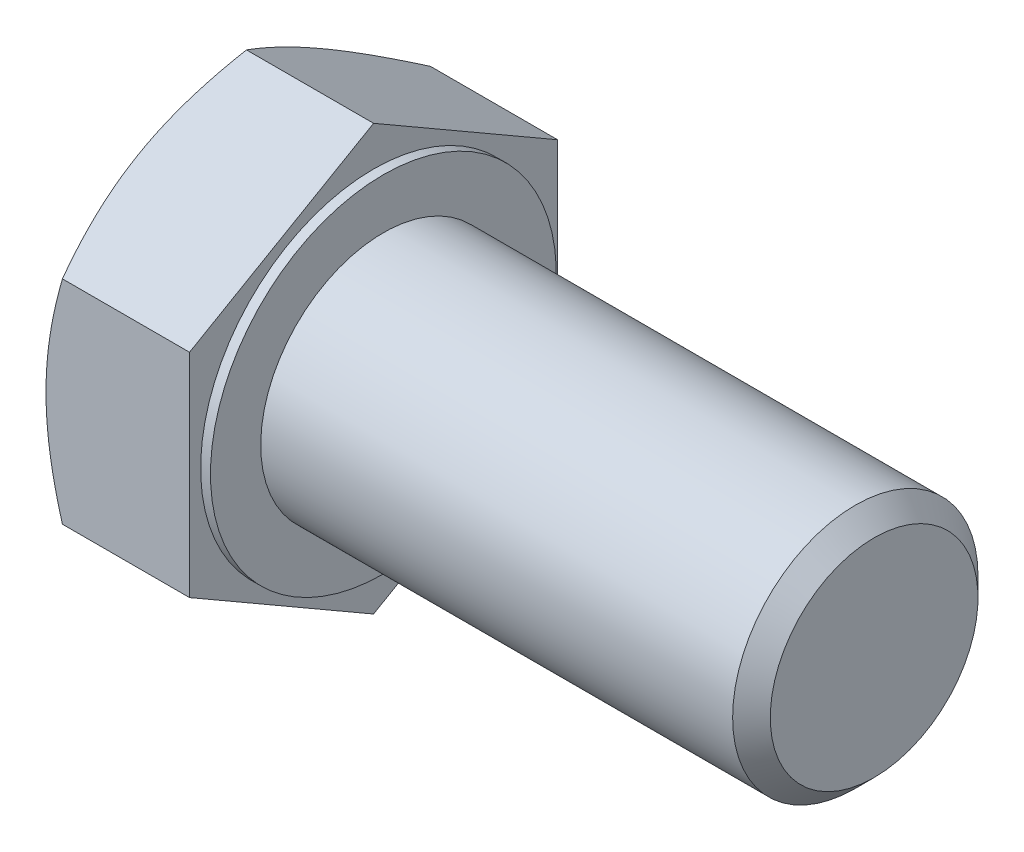
ISO-10303-21;
HEADER;
FILE_DESCRIPTION(('STEP AP214'),'2;1');
FILE_NAME('part.step','',(''),(''),'','','');
FILE_SCHEMA(('AUTOMOTIVE_DESIGN { 1 0 10303 214 1 1 1 1 }'));
ENDSEC;
DATA;
#1=APPLICATION_CONTEXT('core data for automotive mechanical design processes');
#2=APPLICATION_PROTOCOL_DEFINITION('international standard','automotive_design',2000,#1);
#3=PRODUCT_CONTEXT('',#1,'mechanical');
#4=PRODUCT('Part','Part','',(#3));
#5=PRODUCT_RELATED_PRODUCT_CATEGORY('part','',(#4));
#6=PRODUCT_DEFINITION_FORMATION('','',#4);
#7=PRODUCT_DEFINITION_CONTEXT('part definition',#1,'design');
#8=PRODUCT_DEFINITION('design','',#6,#7);
#9=PRODUCT_DEFINITION_SHAPE('','',#8);
#10=(LENGTH_UNIT() NAMED_UNIT(*) SI_UNIT(.MILLI.,.METRE.));
#11=(NAMED_UNIT(*) PLANE_ANGLE_UNIT() SI_UNIT($,.RADIAN.));
#12=(NAMED_UNIT(*) SI_UNIT($,.STERADIAN.) SOLID_ANGLE_UNIT());
#13=UNCERTAINTY_MEASURE_WITH_UNIT(LENGTH_MEASURE(1.E-05),#10,'distance_accuracy_value','');
#14=(GEOMETRIC_REPRESENTATION_CONTEXT(3) GLOBAL_UNCERTAINTY_ASSIGNED_CONTEXT((#13)) GLOBAL_UNIT_ASSIGNED_CONTEXT((#10,
#11,#12)) REPRESENTATION_CONTEXT('',''));
#15=CARTESIAN_POINT('',(0.,0.,0.));
#16=DIRECTION('',(0.,0.,1.));
#17=DIRECTION('',(1.,0.,0.));
#18=AXIS2_PLACEMENT_3D('',#15,#16,#17);
#19=CARTESIAN_POINT('',(0.,12.0475,0.));
#20=DIRECTION('',(1.,0.,0.));
#21=DIRECTION('',(0.,1.,0.));
#22=AXIS2_PLACEMENT_3D('',#19,#20,#21);
#23=PLANE('',#22);
#24=CARTESIAN_POINT('',(0.,0.,0.));
#25=DIRECTION('',(1.,0.,0.));
#26=DIRECTION('',(0.,1.,0.));
#27=AXIS2_PLACEMENT_3D('',#24,#25,#26);
#28=CIRCLE('',#27,10.);
#29=CARTESIAN_POINT('',(0.,-10.,0.));
#30=VERTEX_POINT('',#29);
#31=EDGE_CURVE('E228',#30,#30,#28,.T.);
#32=ORIENTED_EDGE('',*,*,#31,.F.);
#33=EDGE_LOOP('',(#32));
#34=FACE_BOUND('',#33,.T.);
#35=CARTESIAN_POINT('',(0.,0.,0.));
#36=DIRECTION('',(1.,0.,0.));
#37=DIRECTION('',(0.,1.,0.));
#38=AXIS2_PLACEMENT_3D('',#35,#36,#37);
#39=CIRCLE('',#38,14.095);
#40=CARTESIAN_POINT('',(0.,-14.095,0.));
#41=VERTEX_POINT('',#40);
#42=EDGE_CURVE('E28',#41,#41,#39,.T.);
#43=ORIENTED_EDGE('',*,*,#42,.T.);
#44=EDGE_LOOP('',(#43));
#45=FACE_BOUND('',#44,.T.);
#46=ADVANCED_FACE('F17',(#34,#45),#23,.T.);
#47=CARTESIAN_POINT('',(-0.40005,0.,0.));
#48=DIRECTION('',(1.,0.,0.));
#49=DIRECTION('',(0.,1.,0.));
#50=AXIS2_PLACEMENT_3D('',#47,#48,#49);
#51=CYLINDRICAL_SURFACE('',#50,14.095);
#52=ORIENTED_EDGE('',*,*,#42,.F.);
#53=DIRECTION('',(-1.,0.,0.));
#54=VECTOR('',#53,1.);
#55=CARTESIAN_POINT('',(-0.40005,-14.095,0.));
#56=LINE('',#55,#54);
#57=CARTESIAN_POINT('',(-0.8001,-14.095,0.));
#58=VERTEX_POINT('',#57);
#59=EDGE_CURVE('E11',#41,#58,#56,.T.);
#60=ORIENTED_EDGE('',*,*,#59,.T.);
#61=CARTESIAN_POINT('',(-0.8001,0.,0.));
#62=DIRECTION('',(1.,0.,0.));
#63=DIRECTION('',(0.,1.,0.));
#64=AXIS2_PLACEMENT_3D('',#61,#62,#63);
#65=CIRCLE('',#64,14.095);
#66=EDGE_CURVE('E229',#58,#58,#65,.T.);
#67=ORIENTED_EDGE('',*,*,#66,.T.);
#68=ORIENTED_EDGE('',*,*,#59,.F.);
#69=EDGE_LOOP('',(#52,#60,#67,#68));
#70=FACE_BOUND('',#69,.T.);
#71=ADVANCED_FACE('F320',(#70),#51,.T.);
#72=CARTESIAN_POINT('',(-12.5001,0.,0.));
#73=DIRECTION('',(1.,0.,0.));
#74=DIRECTION('',(0.,1.,0.));
#75=AXIS2_PLACEMENT_3D('',#72,#73,#74);
#76=PLANE('',#75);
#77=CARTESIAN_POINT('',(-12.5001,0.,0.));
#78=DIRECTION('',(-1.,0.,0.));
#79=DIRECTION('',(0.,1.,0.));
#80=AXIS2_PLACEMENT_3D('',#77,#78,#79);
#81=CIRCLE('',#80,15.);
#82=CARTESIAN_POINT('',(-12.5001,0.,15.));
#83=VERTEX_POINT('',#82);
#84=CARTESIAN_POINT('',(-12.5001,12.9903810567666,7.5));
#85=VERTEX_POINT('',#84);
#86=EDGE_CURVE('E182',#83,#85,#81,.T.);
#87=ORIENTED_EDGE('',*,*,#86,.T.);
#88=CARTESIAN_POINT('',(-12.5001,0.,0.));
#89=DIRECTION('',(-1.,0.,0.));
#90=DIRECTION('',(0.,1.,0.));
#91=AXIS2_PLACEMENT_3D('',#88,#89,#90);
#92=CIRCLE('',#91,15.);
#93=CARTESIAN_POINT('',(-12.5001,12.9903810567666,-7.5));
#94=VERTEX_POINT('',#93);
#95=EDGE_CURVE('E151',#85,#94,#92,.T.);
#96=ORIENTED_EDGE('',*,*,#95,.T.);
#97=CARTESIAN_POINT('',(-12.5001,0.,0.));
#98=DIRECTION('',(-1.,0.,0.));
#99=DIRECTION('',(0.,1.,0.));
#100=AXIS2_PLACEMENT_3D('',#97,#98,#99);
#101=CIRCLE('',#100,15.);
#102=CARTESIAN_POINT('',(-12.5001,0.,-15.));
#103=VERTEX_POINT('',#102);
#104=EDGE_CURVE('E21',#94,#103,#101,.T.);
#105=ORIENTED_EDGE('',*,*,#104,.T.);
#106=CARTESIAN_POINT('',(-12.5001,0.,0.));
#107=DIRECTION('',(-1.,0.,0.));
#108=DIRECTION('',(0.,1.,0.));
#109=AXIS2_PLACEMENT_3D('',#106,#107,#108);
#110=CIRCLE('',#109,15.);
#111=CARTESIAN_POINT('',(-12.5001,-12.9903810567666,-7.5));
#112=VERTEX_POINT('',#111);
#113=EDGE_CURVE('E120',#103,#112,#110,.T.);
#114=ORIENTED_EDGE('',*,*,#113,.T.);
#115=CARTESIAN_POINT('',(-12.5001,0.,0.));
#116=DIRECTION('',(-1.,0.,0.));
#117=DIRECTION('',(0.,1.,0.));
#118=AXIS2_PLACEMENT_3D('',#115,#116,#117);
#119=CIRCLE('',#118,15.);
#120=CARTESIAN_POINT('',(-12.5001,-12.9903810567666,7.5));
#121=VERTEX_POINT('',#120);
#122=EDGE_CURVE('E158',#112,#121,#119,.T.);
#123=ORIENTED_EDGE('',*,*,#122,.T.);
#124=CARTESIAN_POINT('',(-12.5001,0.,0.));
#125=DIRECTION('',(-1.,0.,0.));
#126=DIRECTION('',(0.,1.,0.));
#127=AXIS2_PLACEMENT_3D('',#124,#125,#126);
#128=CIRCLE('',#127,15.);
#129=EDGE_CURVE('E76',#121,#83,#128,.T.);
#130=ORIENTED_EDGE('',*,*,#129,.T.);
#131=EDGE_LOOP('',(#87,#96,#105,#114,#123,#130));
#132=FACE_BOUND('',#131,.T.);
#133=ADVANCED_FACE('F149',(#132),#76,.F.);
#134=CARTESIAN_POINT('',(-0.8001,-17.3205080756888,0.));
#135=DIRECTION('',(0.,-0.866025403784439,-0.5));
#136=DIRECTION('',(0.,0.5,-0.866025403784439));
#137=AXIS2_PLACEMENT_3D('',#134,#135,#136);
#138=PLANE('',#137);
#139=CARTESIAN_POINT('',(-12.5001,-12.9903810567666,-7.5));
#140=CARTESIAN_POINT('',(-12.5001,-10.9807621135332,-10.9807621135331));
#141=CARTESIAN_POINT('',(-11.1603540378444,-8.66025403784439,-15.));
#142=(BOUNDED_CURVE() B_SPLINE_CURVE(2,(#139,#140,#141),.UNSPECIFIED.,.F.,
.F.) B_SPLINE_CURVE_WITH_KNOTS((3,3),(0.87856457816286,1.75712915632572),
.UNSPECIFIED.) CURVE() GEOMETRIC_REPRESENTATION_ITEM() RATIONAL_B_SPLINE_CURVE((1.,
1.03795484930204,1.)) REPRESENTATION_ITEM(''));
#143=CARTESIAN_POINT('',(-11.1603540378444,-8.66025403784439,-15.));
#144=VERTEX_POINT('',#143);
#145=EDGE_CURVE('E129',#112,#144,#142,.T.);
#146=ORIENTED_EDGE('',*,*,#145,.T.);
#147=DIRECTION('',(-1.,0.,0.));
#148=VECTOR('',#147,1.);
#149=CARTESIAN_POINT('',(-0.8001,-8.66025403784437,-15.));
#150=LINE('',#149,#148);
#151=CARTESIAN_POINT('',(-0.8001,-8.66025403784437,-15.));
#152=VERTEX_POINT('',#151);
#153=EDGE_CURVE('E143',#152,#144,#150,.T.);
#154=ORIENTED_EDGE('',*,*,#153,.F.);
#155=DIRECTION('',(0.,0.5,-0.866025403784439));
#156=VECTOR('',#155,1.);
#157=CARTESIAN_POINT('',(-0.8001,-17.3205080756888,0.));
#158=LINE('',#157,#156);
#159=CARTESIAN_POINT('',(-0.8001,-17.3205080756888,0.));
#160=VERTEX_POINT('',#159);
#161=EDGE_CURVE('E170',#160,#152,#158,.T.);
#162=ORIENTED_EDGE('',*,*,#161,.F.);
#163=DIRECTION('',(-1.,0.,0.));
#164=VECTOR('',#163,1.);
#165=CARTESIAN_POINT('',(-0.8001,-17.3205080756888,0.));
#166=LINE('',#165,#164);
#167=CARTESIAN_POINT('',(-11.1603540378444,-17.3205080756887,0.));
#168=VERTEX_POINT('',#167);
#169=EDGE_CURVE('E203',#160,#168,#166,.T.);
#170=ORIENTED_EDGE('',*,*,#169,.T.);
#171=CARTESIAN_POINT('',(-11.1603540378444,-17.3205080756887,0.));
#172=CARTESIAN_POINT('',(-12.5001,-15.,-4.01923788646686));
#173=CARTESIAN_POINT('',(-12.5001,-12.9903810567666,-7.5));
#174=(BOUNDED_CURVE() B_SPLINE_CURVE(2,(#171,#172,#173),.UNSPECIFIED.,.F.,
.F.) B_SPLINE_CURVE_WITH_KNOTS((3,3),(0.,0.87856457816286),
.UNSPECIFIED.) CURVE() GEOMETRIC_REPRESENTATION_ITEM() RATIONAL_B_SPLINE_CURVE((1.,
1.03795484930204,1.)) REPRESENTATION_ITEM(''));
#175=EDGE_CURVE('E244',#168,#112,#174,.T.);
#176=ORIENTED_EDGE('',*,*,#175,.T.);
#177=EDGE_LOOP('',(#146,#154,#162,#170,#176));
#178=FACE_BOUND('',#177,.T.);
#179=ADVANCED_FACE('F354',(#178),#138,.T.);
#180=CARTESIAN_POINT('',(-0.8001,-8.66025403784439,15.));
#181=DIRECTION('',(0.,-0.866025403784439,0.5));
#182=DIRECTION('',(-1.,0.,0.));
#183=AXIS2_PLACEMENT_3D('',#180,#181,#182);
#184=PLANE('',#183);
#185=CARTESIAN_POINT('',(-12.5001,-12.9903810567666,7.5));
#186=CARTESIAN_POINT('',(-12.5001,-15.,4.01923788646685));
#187=CARTESIAN_POINT('',(-11.1603540378444,-17.3205080756887,0.));
#188=(BOUNDED_CURVE() B_SPLINE_CURVE(2,(#185,#186,#187),.UNSPECIFIED.,.F.,
.F.) B_SPLINE_CURVE_WITH_KNOTS((3,3),(0.878564578162859,1.75712915632572),
.UNSPECIFIED.) CURVE() GEOMETRIC_REPRESENTATION_ITEM() RATIONAL_B_SPLINE_CURVE((1.,
1.03795484930204,1.)) REPRESENTATION_ITEM(''));
#189=EDGE_CURVE('E164',#121,#168,#188,.T.);
#190=ORIENTED_EDGE('',*,*,#189,.T.);
#191=ORIENTED_EDGE('',*,*,#169,.F.);
#192=DIRECTION('',(0.,-0.5,-0.866025403784439));
#193=VECTOR('',#192,1.);
#194=CARTESIAN_POINT('',(-0.8001,-8.66025403784439,15.));
#195=LINE('',#194,#193);
#196=CARTESIAN_POINT('',(-0.8001,-8.66025403784439,15.));
#197=VERTEX_POINT('',#196);
#198=EDGE_CURVE('E290',#197,#160,#195,.T.);
#199=ORIENTED_EDGE('',*,*,#198,.F.);
#200=DIRECTION('',(-1.,0.,0.));
#201=VECTOR('',#200,1.);
#202=CARTESIAN_POINT('',(-0.8001,-8.66025403784439,15.));
#203=LINE('',#202,#201);
#204=CARTESIAN_POINT('',(-11.1603540378444,-8.66025403784436,15.));
#205=VERTEX_POINT('',#204);
#206=EDGE_CURVE('E63',#197,#205,#203,.T.);
#207=ORIENTED_EDGE('',*,*,#206,.T.);
#208=CARTESIAN_POINT('',(-11.1603540378444,-8.66025403784442,15.));
#209=CARTESIAN_POINT('',(-12.5001,-10.9807621135332,10.9807621135331));
#210=CARTESIAN_POINT('',(-12.5001,-12.9903810567666,7.5));
#211=(BOUNDED_CURVE() B_SPLINE_CURVE(2,(#208,#209,#210),.UNSPECIFIED.,.F.,
.F.) B_SPLINE_CURVE_WITH_KNOTS((3,3),(0.,0.878564578162859),
.UNSPECIFIED.) CURVE() GEOMETRIC_REPRESENTATION_ITEM() RATIONAL_B_SPLINE_CURVE((1.,
1.03795484930204,1.)) REPRESENTATION_ITEM(''));
#212=EDGE_CURVE('E181',#205,#121,#211,.T.);
#213=ORIENTED_EDGE('',*,*,#212,.T.);
#214=EDGE_LOOP('',(#190,#191,#199,#207,#213));
#215=FACE_BOUND('',#214,.T.);
#216=ADVANCED_FACE('F347',(#215),#184,.T.);
#217=CARTESIAN_POINT('',(-0.8001,8.66025403784437,15.));
#218=DIRECTION('',(0.,0.,1.));
#219=DIRECTION('',(0.,-1.,0.));
#220=AXIS2_PLACEMENT_3D('',#217,#218,#219);
#221=PLANE('',#220);
#222=CARTESIAN_POINT('',(-12.5001,0.,15.));
#223=CARTESIAN_POINT('',(-12.5001,-4.01923788646683,15.));
#224=CARTESIAN_POINT('',(-11.1603540378444,-8.66025403784436,15.));
#225=(BOUNDED_CURVE() B_SPLINE_CURVE(2,(#222,#223,#224),.UNSPECIFIED.,.F.,
.F.) B_SPLINE_CURVE_WITH_KNOTS((3,3),(0.87856457816286,1.75712915632572),
.UNSPECIFIED.) CURVE() GEOMETRIC_REPRESENTATION_ITEM() RATIONAL_B_SPLINE_CURVE((1.,
1.03795484930204,1.)) REPRESENTATION_ITEM(''));
#226=EDGE_CURVE('E197',#83,#205,#225,.T.);
#227=ORIENTED_EDGE('',*,*,#226,.T.);
#228=ORIENTED_EDGE('',*,*,#206,.F.);
#229=DIRECTION('',(0.,-1.,0.));
#230=VECTOR('',#229,1.);
#231=CARTESIAN_POINT('',(-0.8001,8.66025403784437,15.));
#232=LINE('',#231,#230);
#233=CARTESIAN_POINT('',(-0.8001,8.66025403784437,15.));
#234=VERTEX_POINT('',#233);
#235=EDGE_CURVE('E286',#234,#197,#232,.T.);
#236=ORIENTED_EDGE('',*,*,#235,.F.);
#237=DIRECTION('',(-1.,0.,0.));
#238=VECTOR('',#237,1.);
#239=CARTESIAN_POINT('',(-0.8001,8.66025403784437,15.));
#240=LINE('',#239,#238);
#241=CARTESIAN_POINT('',(-11.1603540378444,8.66025403784434,15.));
#242=VERTEX_POINT('',#241);
#243=EDGE_CURVE('E88',#234,#242,#240,.T.);
#244=ORIENTED_EDGE('',*,*,#243,.T.);
#245=CARTESIAN_POINT('',(-11.1603540378444,8.66025403784433,15.));
#246=CARTESIAN_POINT('',(-12.5001,4.0192378864668,15.));
#247=CARTESIAN_POINT('',(-12.5001,0.,15.));
#248=(BOUNDED_CURVE() B_SPLINE_CURVE(2,(#245,#246,#247),.UNSPECIFIED.,.F.,
.F.) B_SPLINE_CURVE_WITH_KNOTS((3,3),(0.,0.87856457816286),
.UNSPECIFIED.) CURVE() GEOMETRIC_REPRESENTATION_ITEM() RATIONAL_B_SPLINE_CURVE((1.,
1.03795484930203,1.)) REPRESENTATION_ITEM(''));
#249=EDGE_CURVE('E177',#242,#83,#248,.T.);
#250=ORIENTED_EDGE('',*,*,#249,.T.);
#251=EDGE_LOOP('',(#227,#228,#236,#244,#250));
#252=FACE_BOUND('',#251,.T.);
#253=ADVANCED_FACE('F328',(#252),#221,.T.);
#254=CARTESIAN_POINT('',(-0.8001,0.,0.));
#255=DIRECTION('',(1.,0.,0.));
#256=DIRECTION('',(0.,1.,0.));
#257=AXIS2_PLACEMENT_3D('',#254,#255,#256);
#258=PLANE('',#257);
#259=ORIENTED_EDGE('',*,*,#66,.F.);
#260=EDGE_LOOP('',(#259));
#261=FACE_BOUND('',#260,.T.);
#262=DIRECTION('',(0.,-0.5,0.866025403784438));
#263=VECTOR('',#262,1.);
#264=CARTESIAN_POINT('',(-0.8001,17.3205080756888,0.));
#265=LINE('',#264,#263);
#266=CARTESIAN_POINT('',(-0.8001,17.3205080756888,0.));
#267=VERTEX_POINT('',#266);
#268=EDGE_CURVE('E285',#267,#234,#265,.T.);
#269=ORIENTED_EDGE('',*,*,#268,.T.);
#270=ORIENTED_EDGE('',*,*,#235,.T.);
#271=ORIENTED_EDGE('',*,*,#198,.T.);
#272=ORIENTED_EDGE('',*,*,#161,.T.);
#273=DIRECTION('',(0.,1.,0.));
#274=VECTOR('',#273,1.);
#275=CARTESIAN_POINT('',(-0.8001,-8.66025403784437,-15.));
#276=LINE('',#275,#274);
#277=CARTESIAN_POINT('',(-0.8001,8.66025403784438,-15.));
#278=VERTEX_POINT('',#277);
#279=EDGE_CURVE('E176',#152,#278,#276,.T.);
#280=ORIENTED_EDGE('',*,*,#279,.T.);
#281=DIRECTION('',(0.,0.5,0.866025403784439));
#282=VECTOR('',#281,1.);
#283=CARTESIAN_POINT('',(-0.8001,8.66025403784438,-15.));
#284=LINE('',#283,#282);
#285=EDGE_CURVE('E219',#278,#267,#284,.T.);
#286=ORIENTED_EDGE('',*,*,#285,.T.);
#287=EDGE_LOOP('',(#269,#270,#271,#272,#280,#286));
#288=FACE_BOUND('',#287,.T.);
#289=ADVANCED_FACE('F324',(#261,#288),#258,.T.);
#290=CARTESIAN_POINT('',(-0.8001,17.3205080756888,0.));
#291=DIRECTION('',(0.,0.866025403784438,0.5));
#292=DIRECTION('',(1.,0.,0.));
#293=AXIS2_PLACEMENT_3D('',#290,#291,#292);
#294=PLANE('',#293);
#295=CARTESIAN_POINT('',(-11.1603540378444,17.3205080756887,0.));
#296=CARTESIAN_POINT('',(-12.5001,15.,4.01923788646685));
#297=CARTESIAN_POINT('',(-12.5001,12.9903810567666,7.5));
#298=(BOUNDED_CURVE() B_SPLINE_CURVE(2,(#295,#296,#297),.UNSPECIFIED.,.F.,
.F.) B_SPLINE_CURVE_WITH_KNOTS((3,3),(0.,0.87856457816286),
.UNSPECIFIED.) CURVE() GEOMETRIC_REPRESENTATION_ITEM() RATIONAL_B_SPLINE_CURVE((1.,
1.03795484930203,1.)) REPRESENTATION_ITEM(''));
#299=CARTESIAN_POINT('',(-11.1603540378444,17.3205080756887,0.));
#300=VERTEX_POINT('',#299);
#301=EDGE_CURVE('E239',#300,#85,#298,.T.);
#302=ORIENTED_EDGE('',*,*,#301,.T.);
#303=CARTESIAN_POINT('',(-12.5001,12.9903810567666,7.5));
#304=CARTESIAN_POINT('',(-12.5001,10.9807621135331,10.9807621135331));
#305=CARTESIAN_POINT('',(-11.1603540378444,8.66025403784439,15.));
#306=(BOUNDED_CURVE() B_SPLINE_CURVE(2,(#303,#304,#305),.UNSPECIFIED.,.F.,
.F.) B_SPLINE_CURVE_WITH_KNOTS((3,3),(0.87856457816286,1.75712915632572),
.UNSPECIFIED.) CURVE() GEOMETRIC_REPRESENTATION_ITEM() RATIONAL_B_SPLINE_CURVE((1.,
1.03795484930205,1.)) REPRESENTATION_ITEM(''));
#307=EDGE_CURVE('E222',#85,#242,#306,.T.);
#308=ORIENTED_EDGE('',*,*,#307,.T.);
#309=ORIENTED_EDGE('',*,*,#243,.F.);
#310=ORIENTED_EDGE('',*,*,#268,.F.);
#311=DIRECTION('',(-1.,0.,0.));
#312=VECTOR('',#311,1.);
#313=CARTESIAN_POINT('',(-0.8001,17.3205080756888,0.));
#314=LINE('',#313,#312);
#315=EDGE_CURVE('E213',#267,#300,#314,.T.);
#316=ORIENTED_EDGE('',*,*,#315,.T.);
#317=EDGE_LOOP('',(#302,#308,#309,#310,#316));
#318=FACE_BOUND('',#317,.T.);
#319=ADVANCED_FACE('F327',(#318),#294,.T.);
#320=CARTESIAN_POINT('',(-0.8001,8.66025403784438,-15.));
#321=DIRECTION('',(0.,0.866025403784439,-0.5));
#322=DIRECTION('',(-1.,0.,0.));
#323=AXIS2_PLACEMENT_3D('',#320,#321,#322);
#324=PLANE('',#323);
#325=CARTESIAN_POINT('',(-11.1603540378444,8.66025403784439,-15.));
#326=CARTESIAN_POINT('',(-12.5001,10.9807621135331,-10.9807621135331));
#327=CARTESIAN_POINT('',(-12.5001,12.9903810567666,-7.5));
#328=(BOUNDED_CURVE() B_SPLINE_CURVE(2,(#325,#326,#327),.UNSPECIFIED.,.F.,
.F.) B_SPLINE_CURVE_WITH_KNOTS((3,3),(0.,0.878564578162862),
.UNSPECIFIED.) CURVE() GEOMETRIC_REPRESENTATION_ITEM() RATIONAL_B_SPLINE_CURVE((1.,
1.03795484930203,1.)) REPRESENTATION_ITEM(''));
#329=CARTESIAN_POINT('',(-11.1603540378444,8.66025403784436,-15.));
#330=VERTEX_POINT('',#329);
#331=EDGE_CURVE('E145',#330,#94,#328,.T.);
#332=ORIENTED_EDGE('',*,*,#331,.T.);
#333=CARTESIAN_POINT('',(-12.5001,12.9903810567666,-7.5));
#334=CARTESIAN_POINT('',(-12.5001,15.,-4.01923788646684));
#335=CARTESIAN_POINT('',(-11.1603540378444,17.3205080756887,0.));
#336=(BOUNDED_CURVE() B_SPLINE_CURVE(2,(#333,#334,#335),.UNSPECIFIED.,.F.,
.F.) B_SPLINE_CURVE_WITH_KNOTS((3,3),(0.878564578162862,1.75712915632572),
.UNSPECIFIED.) CURVE() GEOMETRIC_REPRESENTATION_ITEM() RATIONAL_B_SPLINE_CURVE((1.,
1.03795484930204,1.)) REPRESENTATION_ITEM(''));
#337=EDGE_CURVE('E207',#94,#300,#336,.T.);
#338=ORIENTED_EDGE('',*,*,#337,.T.);
#339=ORIENTED_EDGE('',*,*,#315,.F.);
#340=ORIENTED_EDGE('',*,*,#285,.F.);
#341=DIRECTION('',(-1.,0.,0.));
#342=VECTOR('',#341,1.);
#343=CARTESIAN_POINT('',(-0.8001,8.66025403784438,-15.));
#344=LINE('',#343,#342);
#345=EDGE_CURVE('E132',#278,#330,#344,.T.);
#346=ORIENTED_EDGE('',*,*,#345,.T.);
#347=EDGE_LOOP('',(#332,#338,#339,#340,#346));
#348=FACE_BOUND('',#347,.T.);
#349=ADVANCED_FACE('F407',(#348),#324,.T.);
#350=CARTESIAN_POINT('',(-0.8001,-8.66025403784437,-15.));
#351=DIRECTION('',(0.,0.,-1.));
#352=DIRECTION('',(-1.,0.,0.));
#353=AXIS2_PLACEMENT_3D('',#350,#351,#352);
#354=PLANE('',#353);
#355=CARTESIAN_POINT('',(-11.1603540378444,-8.66025403784433,-15.));
#356=CARTESIAN_POINT('',(-12.5001,-4.0192378864668,-15.));
#357=CARTESIAN_POINT('',(-12.5001,0.,-15.));
#358=(BOUNDED_CURVE() B_SPLINE_CURVE(2,(#355,#356,#357),.UNSPECIFIED.,.F.,
.F.) B_SPLINE_CURVE_WITH_KNOTS((3,3),(0.,0.878564578162859),
.UNSPECIFIED.) CURVE() GEOMETRIC_REPRESENTATION_ITEM() RATIONAL_B_SPLINE_CURVE((1.,
1.03795484930203,1.)) REPRESENTATION_ITEM(''));
#359=EDGE_CURVE('E127',#144,#103,#358,.T.);
#360=ORIENTED_EDGE('',*,*,#359,.T.);
#361=CARTESIAN_POINT('',(-12.5001,0.,-15.));
#362=CARTESIAN_POINT('',(-12.5001,4.01923788646682,-15.));
#363=CARTESIAN_POINT('',(-11.1603540378444,8.66025403784434,-15.));
#364=(BOUNDED_CURVE() B_SPLINE_CURVE(2,(#361,#362,#363),.UNSPECIFIED.,.F.,
.F.) B_SPLINE_CURVE_WITH_KNOTS((3,3),(0.878564578162859,1.75712915632572),
.UNSPECIFIED.) CURVE() GEOMETRIC_REPRESENTATION_ITEM() RATIONAL_B_SPLINE_CURVE((1.,
1.03795484930204,1.)) REPRESENTATION_ITEM(''));
#365=EDGE_CURVE('E140',#103,#330,#364,.T.);
#366=ORIENTED_EDGE('',*,*,#365,.T.);
#367=ORIENTED_EDGE('',*,*,#345,.F.);
#368=ORIENTED_EDGE('',*,*,#279,.F.);
#369=ORIENTED_EDGE('',*,*,#153,.T.);
#370=EDGE_LOOP('',(#360,#366,#367,#368,#369));
#371=FACE_BOUND('',#370,.T.);
#372=ADVANCED_FACE('F137',(#371),#354,.T.);
#373=CARTESIAN_POINT('',(-11.8302270189222,0.,0.));
#374=DIRECTION('',(1.,0.,0.));
#375=DIRECTION('',(0.,1.,0.));
#376=AXIS2_PLACEMENT_3D('',#373,#374,#375);
#377=CONICAL_SURFACE('',#376,16.1602540378444,1.0471975511966);
#378=ORIENTED_EDGE('',*,*,#359,.F.);
#379=ORIENTED_EDGE('',*,*,#145,.F.);
#380=ORIENTED_EDGE('',*,*,#113,.F.);
#381=EDGE_LOOP('',(#378,#379,#380));
#382=FACE_BOUND('',#381,.T.);
#383=ADVANCED_FACE('F126',(#382),#377,.T.);
#384=CARTESIAN_POINT('',(-11.8302270189222,0.,0.));
#385=DIRECTION('',(1.,0.,0.));
#386=DIRECTION('',(0.,1.,0.));
#387=AXIS2_PLACEMENT_3D('',#384,#385,#386);
#388=CONICAL_SURFACE('',#387,16.1602540378444,1.0471975511966);
#389=ORIENTED_EDGE('',*,*,#365,.F.);
#390=ORIENTED_EDGE('',*,*,#104,.F.);
#391=ORIENTED_EDGE('',*,*,#331,.F.);
#392=EDGE_LOOP('',(#389,#390,#391));
#393=FACE_BOUND('',#392,.T.);
#394=ADVANCED_FACE('F156',(#393),#388,.T.);
#395=CARTESIAN_POINT('',(-11.8302270189222,0.,0.));
#396=DIRECTION('',(1.,0.,0.));
#397=DIRECTION('',(0.,-1.,0.));
#398=AXIS2_PLACEMENT_3D('',#395,#396,#397);
#399=CONICAL_SURFACE('',#398,16.1602540378444,1.0471975511966);
#400=ORIENTED_EDGE('',*,*,#175,.F.);
#401=ORIENTED_EDGE('',*,*,#189,.F.);
#402=ORIENTED_EDGE('',*,*,#122,.F.);
#403=EDGE_LOOP('',(#400,#401,#402));
#404=FACE_BOUND('',#403,.T.);
#405=ADVANCED_FACE('F19',(#404),#399,.T.);
#406=CARTESIAN_POINT('',(-11.8302270189222,0.,0.));
#407=DIRECTION('',(1.,0.,0.));
#408=DIRECTION('',(0.,1.,0.));
#409=AXIS2_PLACEMENT_3D('',#406,#407,#408);
#410=CONICAL_SURFACE('',#409,16.1602540378444,1.0471975511966);
#411=ORIENTED_EDGE('',*,*,#337,.F.);
#412=ORIENTED_EDGE('',*,*,#95,.F.);
#413=ORIENTED_EDGE('',*,*,#301,.F.);
#414=EDGE_LOOP('',(#411,#412,#413));
#415=FACE_BOUND('',#414,.T.);
#416=ADVANCED_FACE('F404',(#415),#410,.T.);
#417=CARTESIAN_POINT('',(-11.8302270189222,0.,0.));
#418=DIRECTION('',(1.,0.,0.));
#419=DIRECTION('',(0.,1.,0.));
#420=AXIS2_PLACEMENT_3D('',#417,#418,#419);
#421=CONICAL_SURFACE('',#420,16.1602540378444,1.0471975511966);
#422=ORIENTED_EDGE('',*,*,#212,.F.);
#423=ORIENTED_EDGE('',*,*,#226,.F.);
#424=ORIENTED_EDGE('',*,*,#129,.F.);
#425=EDGE_LOOP('',(#422,#423,#424));
#426=FACE_BOUND('',#425,.T.);
#427=ADVANCED_FACE('F346',(#426),#421,.T.);
#428=CARTESIAN_POINT('',(-11.8302270189222,0.,0.));
#429=DIRECTION('',(1.,0.,0.));
#430=DIRECTION('',(0.,1.,0.));
#431=AXIS2_PLACEMENT_3D('',#428,#429,#430);
#432=CONICAL_SURFACE('',#431,16.1602540378444,1.0471975511966);
#433=ORIENTED_EDGE('',*,*,#307,.F.);
#434=ORIENTED_EDGE('',*,*,#86,.F.);
#435=ORIENTED_EDGE('',*,*,#249,.F.);
#436=EDGE_LOOP('',(#433,#434,#435));
#437=FACE_BOUND('',#436,.T.);
#438=ADVANCED_FACE('F342',(#437),#432,.T.);
#439=CARTESIAN_POINT('',(40.,5.,0.));
#440=DIRECTION('',(1.,0.,0.));
#441=DIRECTION('',(0.,1.,0.));
#442=AXIS2_PLACEMENT_3D('',#439,#440,#441);
#443=PLANE('',#442);
#444=CARTESIAN_POINT('',(40.,0.,0.));
#445=DIRECTION('',(-1.,0.,0.));
#446=DIRECTION('',(0.,-1.,0.));
#447=AXIS2_PLACEMENT_3D('',#444,#445,#446);
#448=CIRCLE('',#447,8.466375);
#449=CARTESIAN_POINT('',(40.,8.466375,0.));
#450=VERTEX_POINT('',#449);
#451=EDGE_CURVE('E192',#450,#450,#448,.T.);
#452=ORIENTED_EDGE('',*,*,#451,.F.);
#453=EDGE_LOOP('',(#452));
#454=FACE_BOUND('',#453,.T.);
#455=ADVANCED_FACE('F388',(#454),#443,.T.);
#456=CARTESIAN_POINT('',(23.75,0.,0.));
#457=DIRECTION('',(1.,0.,0.));
#458=DIRECTION('',(0.,1.,0.));
#459=AXIS2_PLACEMENT_3D('',#456,#457,#458);
#460=CYLINDRICAL_SURFACE('',#459,10.);
#461=CARTESIAN_POINT('',(38.466275,0.,0.));
#462=DIRECTION('',(1.,0.,0.));
#463=DIRECTION('',(0.,-1.,0.));
#464=AXIS2_PLACEMENT_3D('',#461,#462,#463);
#465=CIRCLE('',#464,10.);
#466=CARTESIAN_POINT('',(38.466275,10.,0.));
#467=VERTEX_POINT('',#466);
#468=CARTESIAN_POINT('',(38.466275,-10.,0.));
#469=VERTEX_POINT('',#468);
#470=EDGE_CURVE('E191',#467,#469,#465,.T.);
#471=ORIENTED_EDGE('',*,*,#470,.F.);
#472=CARTESIAN_POINT('',(38.466275,0.,0.));
#473=DIRECTION('',(1.,0.,0.));
#474=DIRECTION('',(0.,-1.,0.));
#475=AXIS2_PLACEMENT_3D('',#472,#473,#474);
#476=CIRCLE('',#475,10.);
#477=EDGE_CURVE('E259',#469,#467,#476,.T.);
#478=ORIENTED_EDGE('',*,*,#477,.F.);
#479=DIRECTION('',(-1.,0.,0.));
#480=VECTOR('',#479,1.);
#481=CARTESIAN_POINT('',(23.75,-10.,0.));
#482=LINE('',#481,#480);
#483=EDGE_CURVE('E265',#469,#30,#482,.T.);
#484=ORIENTED_EDGE('',*,*,#483,.T.);
#485=ORIENTED_EDGE('',*,*,#31,.T.);
#486=ORIENTED_EDGE('',*,*,#483,.F.);
#487=EDGE_LOOP('',(#471,#478,#484,#485,#486));
#488=FACE_BOUND('',#487,.T.);
#489=ADVANCED_FACE('F313',(#488),#460,.T.);
#490=CARTESIAN_POINT('',(39.2331375,0.,0.));
#491=DIRECTION('',(-1.,0.,0.));
#492=DIRECTION('',(0.,-1.,0.));
#493=AXIS2_PLACEMENT_3D('',#490,#491,#492);
#494=CONICAL_SURFACE('',#493,9.2331875,0.785365561966255);
#495=ORIENTED_EDGE('',*,*,#451,.T.);
#496=DIRECTION('',(-0.707129833503842,0.707083728117703,0.));
#497=VECTOR('',#496,1.);
#498=CARTESIAN_POINT('',(39.2331375,9.2331875,0.));
#499=LINE('',#498,#497);
#500=EDGE_CURVE('E187',#450,#467,#499,.T.);
#501=ORIENTED_EDGE('',*,*,#500,.T.);
#502=ORIENTED_EDGE('',*,*,#470,.T.);
#503=ORIENTED_EDGE('',*,*,#477,.T.);
#504=ORIENTED_EDGE('',*,*,#500,.F.);
#505=EDGE_LOOP('',(#495,#501,#502,#503,#504));
#506=FACE_BOUND('',#505,.T.);
#507=ADVANCED_FACE('F384',(#506),#494,.T.);
#508=CLOSED_SHELL('',(#46,#71,#133,#179,#216,#253,#289,#319,#349,#372,#383,#394,#405,#416,#427,
#438,#455,#489,#507));
#509=MANIFOLD_SOLID_BREP('B1',#508);
#510=ADVANCED_BREP_SHAPE_REPRESENTATION('',(#18,#509),#14);
#511=SHAPE_DEFINITION_REPRESENTATION(#9,#510);
ENDSEC;
END-ISO-10303-21;
